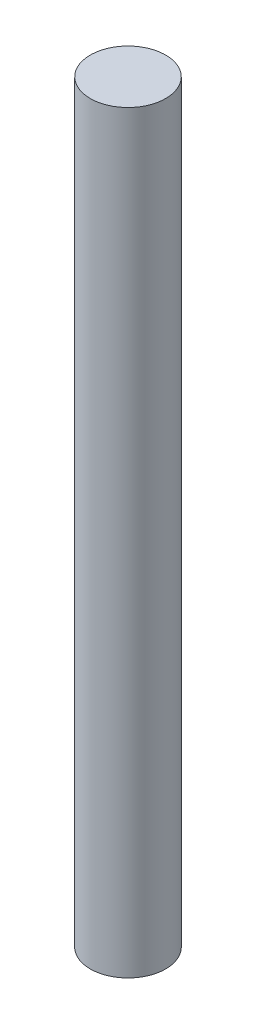
ISO-10303-21;
HEADER;
FILE_DESCRIPTION(('STEP AP214'),'2;1');
FILE_NAME('part.step','',(''),(''),'','','');
FILE_SCHEMA(('AUTOMOTIVE_DESIGN { 1 0 10303 214 1 1 1 1 }'));
ENDSEC;
DATA;
#1=APPLICATION_CONTEXT('core data for automotive mechanical design processes');
#2=APPLICATION_PROTOCOL_DEFINITION('international standard','automotive_design',2000,#1);
#3=PRODUCT_CONTEXT('',#1,'mechanical');
#4=PRODUCT('Part','Part','',(#3));
#5=PRODUCT_RELATED_PRODUCT_CATEGORY('part','',(#4));
#6=PRODUCT_DEFINITION_FORMATION('','',#4);
#7=PRODUCT_DEFINITION_CONTEXT('part definition',#1,'design');
#8=PRODUCT_DEFINITION('design','',#6,#7);
#9=PRODUCT_DEFINITION_SHAPE('','',#8);
#10=(LENGTH_UNIT() NAMED_UNIT(*) SI_UNIT(.MILLI.,.METRE.));
#11=(NAMED_UNIT(*) PLANE_ANGLE_UNIT() SI_UNIT($,.RADIAN.));
#12=(NAMED_UNIT(*) SI_UNIT($,.STERADIAN.) SOLID_ANGLE_UNIT());
#13=UNCERTAINTY_MEASURE_WITH_UNIT(LENGTH_MEASURE(1.E-05),#10,'distance_accuracy_value','');
#14=(GEOMETRIC_REPRESENTATION_CONTEXT(3) GLOBAL_UNCERTAINTY_ASSIGNED_CONTEXT((#13)) GLOBAL_UNIT_ASSIGNED_CONTEXT((#10,
#11,#12)) REPRESENTATION_CONTEXT('',''));
#15=CARTESIAN_POINT('',(0.,0.,0.));
#16=DIRECTION('',(0.,0.,1.));
#17=DIRECTION('',(1.,0.,0.));
#18=AXIS2_PLACEMENT_3D('',#15,#16,#17);
#19=CARTESIAN_POINT('',(0.,200.,0.));
#20=DIRECTION('',(0.,-1.,0.));
#21=DIRECTION('',(0.,0.,-1.));
#22=AXIS2_PLACEMENT_3D('',#19,#20,#21);
#23=CYLINDRICAL_SURFACE('',#22,10.);
#24=CARTESIAN_POINT('',(0.,200.,0.));
#25=DIRECTION('',(0.,1.,0.));
#26=DIRECTION('',(0.,0.,1.));
#27=AXIS2_PLACEMENT_3D('',#24,#25,#26);
#28=CIRCLE('',#27,10.);
#29=CARTESIAN_POINT('',(0.,200.,10.));
#30=VERTEX_POINT('',#29);
#31=EDGE_CURVE('E10',#30,#30,#28,.T.);
#32=ORIENTED_EDGE('',*,*,#31,.F.);
#33=EDGE_LOOP('',(#32));
#34=FACE_BOUND('',#33,.T.);
#35=CARTESIAN_POINT('',(0.,0.,0.));
#36=DIRECTION('',(0.,1.,0.));
#37=DIRECTION('',(0.,0.,1.));
#38=AXIS2_PLACEMENT_3D('',#35,#36,#37);
#39=CIRCLE('',#38,10.);
#40=CARTESIAN_POINT('',(0.,0.,10.));
#41=VERTEX_POINT('',#40);
#42=EDGE_CURVE('E46',#41,#41,#39,.T.);
#43=ORIENTED_EDGE('',*,*,#42,.T.);
#44=EDGE_LOOP('',(#43));
#45=FACE_BOUND('',#44,.T.);
#46=ADVANCED_FACE('F43',(#34,#45),#23,.T.);
#47=CARTESIAN_POINT('',(0.,200.,0.));
#48=DIRECTION('',(0.,1.,0.));
#49=DIRECTION('',(0.,0.,1.));
#50=AXIS2_PLACEMENT_3D('',#47,#48,#49);
#51=PLANE('',#50);
#52=ORIENTED_EDGE('',*,*,#31,.T.);
#53=EDGE_LOOP('',(#52));
#54=FACE_BOUND('',#53,.T.);
#55=ADVANCED_FACE('F60',(#54),#51,.T.);
#56=CARTESIAN_POINT('',(0.,0.,0.));
#57=DIRECTION('',(0.,1.,0.));
#58=DIRECTION('',(0.,0.,1.));
#59=AXIS2_PLACEMENT_3D('',#56,#57,#58);
#60=PLANE('',#59);
#61=ORIENTED_EDGE('',*,*,#42,.F.);
#62=EDGE_LOOP('',(#61));
#63=FACE_BOUND('',#62,.T.);
#64=ADVANCED_FACE('F58',(#63),#60,.F.);
#65=CLOSED_SHELL('',(#46,#55,#64));
#66=MANIFOLD_SOLID_BREP('B2',#65);
#67=ADVANCED_BREP_SHAPE_REPRESENTATION('',(#18,#66),#14);
#68=SHAPE_DEFINITION_REPRESENTATION(#9,#67);
ENDSEC;
END-ISO-10303-21;
